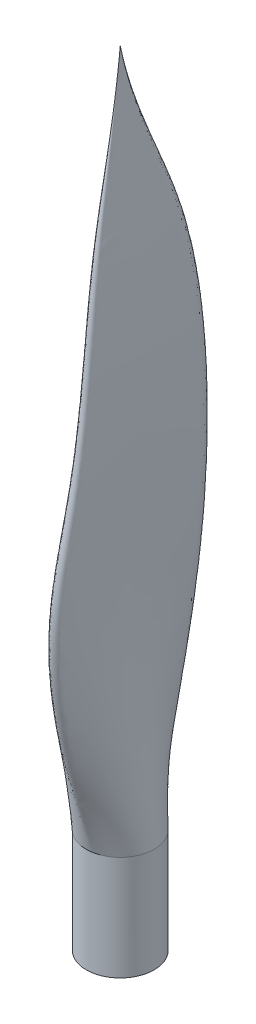
ISO-10303-21;
HEADER;
FILE_DESCRIPTION(('STEP AP214'),'2;1');
FILE_NAME('part.step','',(''),(''),'','','');
FILE_SCHEMA(('AUTOMOTIVE_DESIGN { 1 0 10303 214 1 1 1 1 }'));
ENDSEC;
DATA;
#1=APPLICATION_CONTEXT('core data for automotive mechanical design processes');
#2=APPLICATION_PROTOCOL_DEFINITION('international standard','automotive_design',2000,#1);
#3=PRODUCT_CONTEXT('',#1,'mechanical');
#4=PRODUCT('Part','Part','',(#3));
#5=PRODUCT_RELATED_PRODUCT_CATEGORY('part','',(#4));
#6=PRODUCT_DEFINITION_FORMATION('','',#4);
#7=PRODUCT_DEFINITION_CONTEXT('part definition',#1,'design');
#8=PRODUCT_DEFINITION('design','',#6,#7);
#9=PRODUCT_DEFINITION_SHAPE('','',#8);
#10=(LENGTH_UNIT() NAMED_UNIT(*) SI_UNIT(.MILLI.,.METRE.));
#11=(NAMED_UNIT(*) PLANE_ANGLE_UNIT() SI_UNIT($,.RADIAN.));
#12=(NAMED_UNIT(*) SI_UNIT($,.STERADIAN.) SOLID_ANGLE_UNIT());
#13=UNCERTAINTY_MEASURE_WITH_UNIT(LENGTH_MEASURE(1.E-05),#10,'distance_accuracy_value','');
#14=(GEOMETRIC_REPRESENTATION_CONTEXT(3) GLOBAL_UNCERTAINTY_ASSIGNED_CONTEXT((#13)) GLOBAL_UNIT_ASSIGNED_CONTEXT((#10,
#11,#12)) REPRESENTATION_CONTEXT('',''));
#15=CARTESIAN_POINT('',(0.,0.,0.));
#16=DIRECTION('',(0.,0.,1.));
#17=DIRECTION('',(1.,0.,0.));
#18=AXIS2_PLACEMENT_3D('',#15,#16,#17);
#19=CARTESIAN_POINT('',(0.,25.4,0.));
#20=DIRECTION('',(0.,-1.,0.));
#21=DIRECTION('',(0.,0.,-1.));
#22=AXIS2_PLACEMENT_3D('',#19,#20,#21);
#23=CYLINDRICAL_SURFACE('',#22,8.255);
#24=CARTESIAN_POINT('',(1.84115412709104,25.4,-8.04706011412215));
#25=CARTESIAN_POINT('',(1.49717993514917,25.4,-8.12576084384519));
#26=CARTESIAN_POINT('',(0.986290227768732,25.4,-8.20423412938115));
#27=CARTESIAN_POINT('',(0.327034181211974,25.4,-8.25703622216933));
#28=CARTESIAN_POINT('',(-0.263033159465489,25.4,-8.2568496097391));
#29=CARTESIAN_POINT('',(-0.831131344674344,25.4,-8.22006975737767));
#30=CARTESIAN_POINT('',(-1.39436018145234,25.4,-8.14253171953481));
#31=CARTESIAN_POINT('',(-1.97163806254614,25.4,-8.02471432319632));
#32=CARTESIAN_POINT('',(-2.60310540493009,25.4,-7.84262332708647));
#33=CARTESIAN_POINT('',(-3.08471626282393,25.4,-7.664744642292));
#34=CARTESIAN_POINT('',(-4.16300305604926,25.4,-7.17758326568541));
#35=CARTESIAN_POINT('',(-5.63406914641218,25.4,-6.23048347674027));
#36=CARTESIAN_POINT('',(-7.3724572333223,25.3999999999999,-4.06011158280135));
#37=CARTESIAN_POINT('',(-8.32971236214597,25.4000000000001,-1.30146859576701));
#38=CARTESIAN_POINT('',(-8.26276954584924,25.3999999999999,1.72455790814148));
#39=CARTESIAN_POINT('',(-7.09482791154622,25.4,4.57889572099749));
#40=CARTESIAN_POINT('',(-4.97687527661067,25.4,6.81671506762852));
#41=CARTESIAN_POINT('',(-2.25433759982899,25.4,8.12266447292905));
#42=CARTESIAN_POINT('',(-0.323714364054617,25.4,8.30119679332006));
#43=CARTESIAN_POINT('',(0.68201723579083,25.4,8.22712831785102));
#44=CARTESIAN_POINT('',(0.801778347374316,25.4,8.21676816500025));
#45=CARTESIAN_POINT('',(0.931938469183497,25.4,8.20219557928466));
#46=CARTESIAN_POINT('',(1.0581032988237,25.4,8.18718479491041));
#47=CARTESIAN_POINT('',(1.18248537974389,25.4,8.17053972831056));
#48=CARTESIAN_POINT('',(1.30729725539303,25.4,8.15106429591818));
#49=CARTESIAN_POINT('',(1.43342004251679,25.4,8.12955497261165));
#50=CARTESIAN_POINT('',(1.5617348578608,25.4,8.10680823326937));
#51=CARTESIAN_POINT('',(1.68166405297273,25.4,8.08227742461166));
#52=CARTESIAN_POINT('',(2.63714503524418,25.4,7.8739624725323));
#53=CARTESIAN_POINT('',(4.38080615059333,25.4,7.18954116966648));
#54=CARTESIAN_POINT('',(6.58778687055213,25.4,5.26043698480749));
#55=CARTESIAN_POINT('',(8.01641866313439,25.4,2.62293468221777));
#56=CARTESIAN_POINT('',(8.42366005220756,25.4,-0.351894740143555));
#57=CARTESIAN_POINT('',(7.78040109494694,25.4,-3.21948472135602));
#58=CARTESIAN_POINT('',(6.266955385657,25.4,-5.60105791862049));
#59=CARTESIAN_POINT('',(4.18183763642812,25.4,-7.27157708774657));
#60=CARTESIAN_POINT('',(2.62084253577645,25.4,-7.8686686877953));
#61=CARTESIAN_POINT('',(1.84115412709104,25.4,-8.04706011412215));
#62=B_SPLINE_CURVE_WITH_KNOTS('',3,(#24,#25,#26,#27,#28,#29,#30,#31,#32,#33,#34,#35,#36,#37,#38,
#39,#40,#41,#42,#43,#44,#45,#46,#47,#48,#49,#50,#51,#52,#53,#54,#55,#56,#57,#58,#59,#60,#61),
.UNSPECIFIED.,.T.,.F.,(4,1,1,1,1,1,1,1,2,1,1,1,1,1,1,1,2,1,1,1,1,1,1,1,2,1,1,1,1,1,1,1,4),(0.,
0.0211926335383978,0.0423852670767956,0.0635779006151934,0.0847705341535912,0.105963167691989,
0.127155801230387,0.148348434768785,0.169541068307182,0.221112768587106,0.272684468867029,
0.324256169146952,0.375827869426875,0.427399569706798,0.478971269986721,0.530542970266644,
0.582114670546568,0.586312864422188,0.590511058297807,0.594709252173427,0.598907446049047,
0.603105639924667,0.607303833800287,0.611502027675907,0.615700221551527,0.663737693857586,
0.711775166163645,0.759812638469704,0.807850110775763,0.855887583081823,0.903925055387882,
0.951962527693941,1.),.UNSPECIFIED.);
#63=CARTESIAN_POINT('',(1.84115412709104,25.4,-8.04706011412215));
#64=VERTEX_POINT('',#63);
#65=EDGE_CURVE('E12',#64,#64,#62,.T.);
#66=ORIENTED_EDGE('',*,*,#65,.F.);
#67=EDGE_LOOP('',(#66));
#68=FACE_BOUND('',#67,.T.);
#69=CARTESIAN_POINT('',(0.,0.,0.));
#70=DIRECTION('',(0.,1.,0.));
#71=DIRECTION('',(0.,0.,1.));
#72=AXIS2_PLACEMENT_3D('',#69,#70,#71);
#73=CIRCLE('',#72,8.255);
#74=CARTESIAN_POINT('',(0.,0.,8.255));
#75=VERTEX_POINT('',#74);
#76=EDGE_CURVE('E210',#75,#75,#73,.T.);
#77=ORIENTED_EDGE('',*,*,#76,.T.);
#78=EDGE_LOOP('',(#77));
#79=FACE_BOUND('',#78,.T.);
#80=ADVANCED_FACE('F201',(#68,#79),#23,.T.);
#81=CARTESIAN_POINT('',(0.,0.,0.));
#82=DIRECTION('',(0.,1.,0.));
#83=DIRECTION('',(0.,0.,1.));
#84=AXIS2_PLACEMENT_3D('',#81,#82,#83);
#85=PLANE('',#84);
#86=ORIENTED_EDGE('',*,*,#76,.F.);
#87=EDGE_LOOP('',(#86));
#88=FACE_BOUND('',#87,.T.);
#89=ADVANCED_FACE('F216',(#88),#85,.F.);
#90=CARTESIAN_POINT('',(1.84115412709104,25.4,-8.04706011412215));
#91=CARTESIAN_POINT('',(3.25193581908319,44.423928371545,-9.78031712313258));
#92=CARTESIAN_POINT('',(5.30619347923773,71.9693253666984,-12.120580128144));
#93=CARTESIAN_POINT('',(5.2012290604936,114.112293140247,-14.6789167141253));
#94=CARTESIAN_POINT('',(3.49988283151982,151.891405122874,-13.032066237447));
#95=CARTESIAN_POINT('',(0.922656533270414,175.717015002163,-1.99998733283843));
#96=CARTESIAN_POINT('',(0.,190.5,0.));
#97=CARTESIAN_POINT('',(1.49717993514917,25.4,-8.12576084384519));
#98=CARTESIAN_POINT('',(3.02258788180731,44.4165185098628,-10.0932872446538));
#99=CARTESIAN_POINT('',(5.35057314737717,71.9706156172485,-12.7847195603257));
#100=CARTESIAN_POINT('',(5.18606949551939,114.112075864832,-15.2299437420504));
#101=CARTESIAN_POINT('',(3.50729479196382,151.889799232988,-13.4542906195367));
#102=CARTESIAN_POINT('',(0.917246933791929,175.720230162646,-2.09366665955012));
#103=CARTESIAN_POINT('',(0.,190.5,0.));
#104=CARTESIAN_POINT('',(0.986290227768732,25.4,-8.20423412938115));
#105=CARTESIAN_POINT('',(2.68717177186681,44.3993731419126,-10.6643020251995));
#106=CARTESIAN_POINT('',(5.14691431773129,71.9736292573222,-14.1124173721181));
#107=CARTESIAN_POINT('',(4.99583879884133,114.111519631752,-16.3999608149184));
#108=CARTESIAN_POINT('',(3.35329977934639,151.886445646884,-14.334472390189));
#109=CARTESIAN_POINT('',(0.898292624052649,175.727004195932,-2.28731034055319));
#110=CARTESIAN_POINT('',(0.,190.5,0.));
#111=CARTESIAN_POINT('',(0.327034181211974,25.4,-8.25703622216933));
#112=CARTESIAN_POINT('',(1.87950574964884,44.3794119382437,-11.3816894266538));
#113=CARTESIAN_POINT('',(4.18810321904492,71.9770760939513,-15.8080049400686));
#114=CARTESIAN_POINT('',(3.99725065333323,114.110989226499,-18.13888102842));
#115=CARTESIAN_POINT('',(2.60526046888929,151.881747771933,-15.5427121596919));
#116=CARTESIAN_POINT('',(0.735616362996278,175.736348449487,-2.59508485952896));
#117=CARTESIAN_POINT('',(0.,190.5,0.));
#118=CARTESIAN_POINT('',(-0.263033159465489,25.4,-8.2568496097391));
#119=CARTESIAN_POINT('',(0.931726752205576,44.3653299880243,-11.8753129790084));
#120=CARTESIAN_POINT('',(2.7334052699781,71.9794790756047,-17.0218429743672));
#121=CARTESIAN_POINT('',(2.25171695521837,114.110669406917,-19.4757792169465));
#122=CARTESIAN_POINT('',(1.37351429992004,151.878065442779,-16.3909427946752));
#123=CARTESIAN_POINT('',(0.440292277554416,175.743616774866,-2.84324484653332));
#124=CARTESIAN_POINT('',(0.,190.5,0.));
#125=CARTESIAN_POINT('',(-0.831131344674344,25.4,-8.22006975737767));
#126=CARTESIAN_POINT('',(-0.137649790736217,44.3584705684158,-12.1077391290117));
#127=CARTESIAN_POINT('',(0.984436866039562,71.9806429282082,-17.6600488421525));
#128=CARTESIAN_POINT('',(-0.00946742801504991,114.110526254823,-20.000936758989));
#129=CARTESIAN_POINT('',(-0.13514834657797,151.876186196272,-16.6538979296817));
#130=CARTESIAN_POINT('',(0.0418238496796534,175.747314398141,-2.95531055231167));
#131=CARTESIAN_POINT('',(0.,190.5,0.));
#132=CARTESIAN_POINT('',(-1.39436018145234,25.4,-8.14253171953481));
#133=CARTESIAN_POINT('',(-1.25241955836452,44.3589219462219,-12.0486324584465));
#134=CARTESIAN_POINT('',(-0.892070789512111,71.9805872477329,-17.6712470894075));
#135=CARTESIAN_POINT('',(-2.29066531629809,114.110495998342,-19.5156650422822));
#136=CARTESIAN_POINT('',(-1.60128346522,151.876578540164,-16.2609962270374));
#137=CARTESIAN_POINT('',(-0.371147839447772,175.746577509135,-2.88597525996165));
#138=CARTESIAN_POINT('',(0.,190.5,0.));
#139=CARTESIAN_POINT('',(-1.97163806254614,25.4,-8.02471432319632));
#140=CARTESIAN_POINT('',(-2.32914748715029,44.3676908299642,-11.6857964351248));
#141=CARTESIAN_POINT('',(-2.70813188998264,71.9791109824802,-17.0047155016168));
#142=CARTESIAN_POINT('',(-4.07704998661691,114.110657040954,-18.1863026982294));
#143=CARTESIAN_POINT('',(-2.73368955174035,151.879129616123,-15.3387534844781));
#144=CARTESIAN_POINT('',(-0.69952791224345,175.741577408667,-2.66080355631739));
#145=CARTESIAN_POINT('',(0.,190.5,0.));
#146=CARTESIAN_POINT('',(-2.60310540493009,25.4,-7.84262332708647));
#147=CARTESIAN_POINT('',(-3.31676094489036,44.3843663823477,-11.0222552401379));
#148=CARTESIAN_POINT('',(-4.19958973650646,71.976241254327,-15.667201740982));
#149=CARTESIAN_POINT('',(-5.10231050651033,114.111081631051,-16.4231995906025));
#150=CARTESIAN_POINT('',(-3.37947417739705,151.883179554805,-14.1230946173423));
#151=CARTESIAN_POINT('',(-0.894159305830881,175.733540981258,-2.35344897522832));
#152=CARTESIAN_POINT('',(0.,190.5,0.));
#153=CARTESIAN_POINT('',(-3.08471626282393,25.4,-7.664744642292));
#154=CARTESIAN_POINT('',(-3.78668643466828,44.4000032029981,-10.416495905181));
#155=CARTESIAN_POINT('',(-4.80483199973343,71.9735055061004,-14.4208413853841));
#156=CARTESIAN_POINT('',(-5.29089071055418,114.111564754941,-15.232472610991));
#157=CARTESIAN_POINT('',(-3.48570261404806,151.886401738797,-13.2650058706076));
#158=CARTESIAN_POINT('',(-0.926259412855449,175.727062311381,-2.15273471404465));
#159=CARTESIAN_POINT('',(0.,190.5,0.));
#160=CARTESIAN_POINT('',(-4.16300305604926,25.4,-7.17758326568541));
#161=CARTESIAN_POINT('',(-4.75095093626708,44.4242338249097,-9.22051641074802));
#162=CARTESIAN_POINT('',(-5.32901970524825,71.9693008623247,-12.1486437897185));
#163=CARTESIAN_POINT('',(-5.32559390650783,114.112247660175,-13.3139975105815));
#164=CARTESIAN_POINT('',(-3.39953184415019,151.891839957212,-11.8599668637737));
#165=CARTESIAN_POINT('',(-0.96016686119634,175.716205279192,-1.81797000076624));
#166=CARTESIAN_POINT('',(0.,190.5,0.));
#167=CARTESIAN_POINT('',(-5.63406914641218,25.4,-6.23048347674027));
#168=CARTESIAN_POINT('',(-5.73627500635091,44.4495649735887,-7.35745679527305));
#169=CARTESIAN_POINT('',(-5.93925980452607,71.9650376166274,-8.8822461276516));
#170=CARTESIAN_POINT('',(-5.23457578248082,114.112710364502,-10.6575548996887));
#171=CARTESIAN_POINT('',(-3.26858167326649,151.899226373204,-9.90264653387319));
#172=CARTESIAN_POINT('',(-0.935102466623599,175.701730017172,-1.3772760743114));
#173=CARTESIAN_POINT('',(0.,190.5,0.));
#174=CARTESIAN_POINT('',(-7.3724572333223,25.3999999999999,-4.06011158280135));
#175=CARTESIAN_POINT('',(-6.93389630752563,44.4597741430992,-4.09357467256563));
#176=CARTESIAN_POINT('',(-6.26213655741706,71.963805428967,-3.93187598195676));
#177=CARTESIAN_POINT('',(-4.79128432828589,114.111974442191,-6.83157466638817));
#178=CARTESIAN_POINT('',(-2.93967011796197,151.908449666949,-7.08007032068755));
#179=CARTESIAN_POINT('',(-0.858242455663168,175.684421472703,-0.731792295467551));
#180=CARTESIAN_POINT('',(0.,190.5,0.));
#181=CARTESIAN_POINT('',(-8.32971236214597,25.4000000000001,-1.30146859576701));
#182=CARTESIAN_POINT('',(-7.39355881376975,44.4573009782813,-0.486869382902787));
#183=CARTESIAN_POINT('',(-6.06194019260981,71.9648462102592,1.00584139435668));
#184=CARTESIAN_POINT('',(-4.0530447132994,114.11074395821,-3.14878413882903));
#185=CARTESIAN_POINT('',(-2.51432862618208,151.915755198957,-4.31947855885464));
#186=CARTESIAN_POINT('',(-0.708435036659855,175.671089652029,-0.126244846547242));
#187=CARTESIAN_POINT('',(0.,190.5,0.));
#188=CARTESIAN_POINT('',(-8.26276954584924,25.3999999999999,1.72455790814148));
#189=CARTESIAN_POINT('',(-7.0562484539579,44.450524680401,3.25435898795937));
#190=CARTESIAN_POINT('',(-5.35282349523606,71.9665344657388,5.88728321176872));
#191=CARTESIAN_POINT('',(-3.03436286823088,114.10958052511,0.39804664773972));
#192=CARTESIAN_POINT('',(-1.98241797476248,151.920819627909,-1.6025380337972));
#193=CARTESIAN_POINT('',(-0.503537251429323,175.662028721944,0.446798367788752));
#194=CARTESIAN_POINT('',(0.,190.5,0.));
#195=CARTESIAN_POINT('',(-7.09482791154622,25.4,4.57889572099749));
#196=CARTESIAN_POINT('',(-5.85416898537577,44.4408237683852,6.85273221916928));
#197=CARTESIAN_POINT('',(-4.15131448267477,71.9685946707329,10.6825777153337));
#198=CARTESIAN_POINT('',(-1.7478815590794,114.108591917082,3.81085260427875));
#199=CARTESIAN_POINT('',(-1.34276880496047,151.923485611444,1.09625416505431));
#200=CARTESIAN_POINT('',(-0.245242671588871,175.657478397108,0.984070324237363));
#201=CARTESIAN_POINT('',(0.,190.5,0.));
#202=CARTESIAN_POINT('',(-4.97687527661067,25.4,6.81671506762852));
#203=CARTESIAN_POINT('',(-3.90978250052306,44.4187097085383,10.0355146126489));
#204=CARTESIAN_POINT('',(-2.45480281490692,71.9728193779999,15.3653558978912));
#205=CARTESIAN_POINT('',(-0.201918025390703,114.107233538607,7.08747526475879));
#206=CARTESIAN_POINT('',(-0.582219597779455,151.923500560333,3.79259161970385));
#207=CARTESIAN_POINT('',(0.0608291690581933,175.658242191734,1.49364873083071));
#208=CARTESIAN_POINT('',(0.,190.5,0.));
#209=CARTESIAN_POINT('',(-2.25433759982899,25.4,8.12266447292905));
#210=CARTESIAN_POINT('',(-1.33375369485937,44.3677040262478,12.5774760107898));
#211=CARTESIAN_POINT('',(-0.263538466577323,71.9824196111269,19.9017373638599));
#212=CARTESIAN_POINT('',(1.59708625733762,114.104373715482,10.2257056833467));
#213=CARTESIAN_POINT('',(0.304588172988622,151.921684624163,6.52223831321908));
#214=CARTESIAN_POINT('',(0.422970768970979,175.663403096267,1.94504205187558));
#215=CARTESIAN_POINT('',(0.,190.5,0.));
#216=CARTESIAN_POINT('',(-0.323714364054617,25.4,8.30119679332006));
#217=CARTESIAN_POINT('',(0.408725368204494,44.2992890395725,13.8317190720243));
#218=CARTESIAN_POINT('',(1.57797079091785,71.9951483050161,22.7796465508092));
#219=CARTESIAN_POINT('',(2.94904856039841,114.100819227925,12.2350870642795));
#220=CARTESIAN_POINT('',(1.01487869387209,151.917342923535,8.33690921726529));
#221=CARTESIAN_POINT('',(0.676497205286913,175.673826763893,2.27948970713105));
#222=CARTESIAN_POINT('',(0.,190.5,0.));
#223=CARTESIAN_POINT('',(0.68201723579083,25.4,8.22712831785102));
#224=CARTESIAN_POINT('',(1.54298362170854,44.2528860997852,14.3464047620057));
#225=CARTESIAN_POINT('',(2.63267800106836,72.0039174278858,24.2948987812544));
#226=CARTESIAN_POINT('',(3.73836183048474,114.098150645209,13.2914669561318));
#227=CARTESIAN_POINT('',(1.41716310330764,151.916143413887,9.36203137848957));
#228=CARTESIAN_POINT('',(0.842550405378267,175.677690599496,2.39362066282499));
#229=CARTESIAN_POINT('',(0.,190.5,0.));
#230=CARTESIAN_POINT('',(0.801778347374316,25.4,8.21676816500025));
#231=CARTESIAN_POINT('',(1.68491694453947,44.2457846084258,14.42477117534));
#232=CARTESIAN_POINT('',(2.84198236921877,72.0052607784866,24.5116804237701));
#233=CARTESIAN_POINT('',(3.87917322314153,114.097739728078,13.4252557105047));
#234=CARTESIAN_POINT('',(1.5052189076266,151.915976893203,9.52456517044034));
#235=CARTESIAN_POINT('',(0.867905462307406,175.678250595236,2.40998601338715));
#236=CARTESIAN_POINT('',(0.,190.5,0.));
#237=CARTESIAN_POINT('',(0.931938469183497,25.4,8.20219557928466));
#238=CARTESIAN_POINT('',(1.93151016244523,44.2373672013131,14.5014583057855));
#239=CARTESIAN_POINT('',(3.26799885597561,72.0069036977398,24.7485684797359));
#240=CARTESIAN_POINT('',(4.12770339265276,114.09715655165,13.5395146804045));
#241=CARTESIAN_POINT('',(1.75503787425847,151.916430394649,9.77156292386616));
#242=CARTESIAN_POINT('',(0.900237810263141,175.677718690434,2.40228695212746));
#243=CARTESIAN_POINT('',(0.,190.5,0.));
#244=CARTESIAN_POINT('',(1.0581032988237,25.4,8.18718479491041));
#245=CARTESIAN_POINT('',(2.20212371990758,44.2324508362961,14.5209553735285));
#246=CARTESIAN_POINT('',(3.79041335458438,72.0078799353278,24.8333862564953));
#247=CARTESIAN_POINT('',(4.37883125858369,114.096784324571,13.5666077098908));
#248=CARTESIAN_POINT('',(2.14521433655231,151.916909332466,9.9444588059548));
#249=CARTESIAN_POINT('',(0.910291698591051,175.677014789222,2.38228239835888));
#250=CARTESIAN_POINT('',(0.,190.5,0.));
#251=CARTESIAN_POINT('',(1.18248537974389,25.4,8.17053972831056));
#252=CARTESIAN_POINT('',(2.47576414137225,44.2317533297143,14.4763924992297));
#253=CARTESIAN_POINT('',(4.32660957535947,72.0080125813576,24.7455179581592));
#254=CARTESIAN_POINT('',(4.61549802566433,114.096742631159,13.5243072063321));
#255=CARTESIAN_POINT('',(2.62593012443705,151.916902005318,9.94738137292336));
#256=CARTESIAN_POINT('',(0.901144525113982,175.677053206493,2.36872985826588));
#257=CARTESIAN_POINT('',(0.,190.5,0.));
#258=CARTESIAN_POINT('',(1.30729725539303,25.4,8.15106429591818));
#259=CARTESIAN_POINT('',(2.7227810637493,44.2359430469938,14.3626237846415));
#260=CARTESIAN_POINT('',(4.78925013500737,72.0071392552685,24.4689530659384));
#261=CARTESIAN_POINT('',(4.83221191845983,114.097138372897,13.4211261827931));
#262=CARTESIAN_POINT('',(3.0654422147348,151.915962061227,9.74787805264842));
#263=CARTESIAN_POINT('',(0.892399294176822,175.678629979322,2.36989605945696));
#264=CARTESIAN_POINT('',(0.,190.5,0.));
#265=CARTESIAN_POINT('',(1.43342004251679,25.4,8.12955497261165));
#266=CARTESIAN_POINT('',(2.92588176681235,44.2439089752287,14.2042019373066));
#267=CARTESIAN_POINT('',(5.1287801729436,72.0055149960865,24.0732904445053));
#268=CARTESIAN_POINT('',(5.02019784873948,114.097822096208,13.2554740732814));
#269=CARTESIAN_POINT('',(3.35411914784084,151.914640180212,9.42759477258543));
#270=CARTESIAN_POINT('',(0.899217860208275,175.680773257532,2.37204140300435));
#271=CARTESIAN_POINT('',(0.,190.5,0.));
#272=CARTESIAN_POINT('',(1.5617348578608,25.4,8.10680823326937));
#273=CARTESIAN_POINT('',(3.07628637492338,44.2545638519954,14.0230476773619));
#274=CARTESIAN_POINT('',(5.30201263685587,72.003405742262,23.6308847949349));
#275=CARTESIAN_POINT('',(5.15603183391763,114.098616509433,13.0213227027683));
#276=CARTESIAN_POINT('',(3.48506438675208,151.91368541999,9.09713509751425));
#277=CARTESIAN_POINT('',(0.917121956622545,175.682145919968,2.35703702728463));
#278=CARTESIAN_POINT('',(0.,190.5,0.));
#279=CARTESIAN_POINT('',(1.68166405297273,25.4,8.08227742461166));
#280=CARTESIAN_POINT('',(3.1475925511459,44.2624769944777,13.9002790554087));
#281=CARTESIAN_POINT('',(5.32632073157193,72.0018938098251,23.3396378901271));
#282=CARTESIAN_POINT('',(5.19445273810908,114.099102947281,12.8336143348677));
#283=CARTESIAN_POINT('',(3.5024381607512,151.913677598573,8.9096604445809));
#284=CARTESIAN_POINT('',(0.921695847880551,175.681877150439,2.33051469635673));
#285=CARTESIAN_POINT('',(0.,190.5,0.));
#286=CARTESIAN_POINT('',(2.63714503524418,25.4,7.8739624725323));
#287=CARTESIAN_POINT('',(3.78621265767225,44.3104832647447,13.0913418625027));
#288=CARTESIAN_POINT('',(5.20233609429305,71.9927318428258,21.6543549727434));
#289=CARTESIAN_POINT('',(5.23744139930534,114.102034260202,11.6225271309381));
#290=CARTESIAN_POINT('',(3.47653917598813,151.913763794071,7.8591924751684));
#291=CARTESIAN_POINT('',(0.946422205522145,175.680001112291,2.16299177141531));
#292=CARTESIAN_POINT('',(0.,190.5,0.));
#293=CARTESIAN_POINT('',(4.38080615059333,25.4,7.18954116966648));
#294=CARTESIAN_POINT('',(4.64472249396847,44.3730399528699,11.5239466245468));
#295=CARTESIAN_POINT('',(5.0384665617096,71.9810173609427,18.5849593169939));
#296=CARTESIAN_POINT('',(5.28990743131585,114.105428110133,9.4074290408859));
#297=CARTESIAN_POINT('',(3.4777791114959,151.916760412261,5.9913546567724));
#298=CARTESIAN_POINT('',(0.913426379927831,175.672257984121,1.80179641682175));
#299=CARTESIAN_POINT('',(0.,190.5,0.));
#300=CARTESIAN_POINT('',(6.58778687055213,25.4,5.26043698480749));
#301=CARTESIAN_POINT('',(5.94238462841359,44.4097039419602,8.59506898723919));
#302=CARTESIAN_POINT('',(4.78809014509837,71.974114691735,14.1220305784726));
#303=CARTESIAN_POINT('',(5.37430320889039,114.107487255136,6.08883326545749));
#304=CARTESIAN_POINT('',(3.4451720867961,151.918042436538,3.24921284536401));
#305=CARTESIAN_POINT('',(0.926894488584444,175.668591034746,1.30132554405796));
#306=CARTESIAN_POINT('',(0.,190.5,0.));
#307=CARTESIAN_POINT('',(8.01641866313439,25.4,2.62293468221777));
#308=CARTESIAN_POINT('',(6.73444181394648,44.4190117391664,5.29304126464446));
#309=CARTESIAN_POINT('',(4.63576656889073,71.9723912208337,9.75684296961429));
#310=CARTESIAN_POINT('',(5.42486848631863,114.107955170343,2.75530888459083));
#311=CARTESIAN_POINT('',(3.43168648312887,151.918739232766,0.56332660860507));
#312=CARTESIAN_POINT('',(0.923327299211562,175.666977976115,0.784900846690767));
#313=CARTESIAN_POINT('',(0.,190.5,0.));
#314=CARTESIAN_POINT('',(8.42366005220756,25.4,-0.351894740143555));
#315=CARTESIAN_POINT('',(6.96866217354593,44.4251901341896,1.80100318728092));
#316=CARTESIAN_POINT('',(4.59063409323285,71.9711191036701,5.44821547469933));
#317=CARTESIAN_POINT('',(5.43998947003711,114.108508882832,-0.60621229290071));
#318=CARTESIAN_POINT('',(3.42655925462057,151.917555417085,-2.09897508703535));
#319=CARTESIAN_POINT('',(0.92436549200329,175.668931586499,0.263570672436063));
#320=CARTESIAN_POINT('',(0.,190.5,0.));
#321=CARTESIAN_POINT('',(7.78040109494694,25.4,-3.21948472135602));
#322=CARTESIAN_POINT('',(6.60072405705777,44.4395105257555,-1.62638415907198));
#323=CARTESIAN_POINT('',(4.66150285186325,71.9681380160546,1.1420040100786));
#324=CARTESIAN_POINT('',(5.41629297083162,114.109854067362,-4.00573463098798));
#325=CARTESIAN_POINT('',(3.43422669572812,151.914393185095,-4.76140886977416));
#326=CARTESIAN_POINT('',(0.923445422020977,175.674228235069,-0.270625016552304));
#327=CARTESIAN_POINT('',(0.,190.5,0.));
#328=CARTESIAN_POINT('',(6.266955385657,25.4,-5.60105791862049));
#329=CARTESIAN_POINT('',(5.7592397937824,44.4568854222379,-4.77824421199937));
#330=CARTESIAN_POINT('',(4.82342035971325,71.9644050378797,-3.20572109053648));
#331=CARTESIAN_POINT('',(5.36240443840726,114.111706389881,-7.46022157024789));
#332=CARTESIAN_POINT('',(3.44969021705372,151.909065212048,-7.45094026417791));
#333=CARTESIAN_POINT('',(0.925147697024292,175.683394072517,-0.820051624129062));
#334=CARTESIAN_POINT('',(0.,190.5,0.));
#335=CARTESIAN_POINT('',(4.18183763642812,25.4,-7.27157708774657));
#336=CARTESIAN_POINT('',(4.53683350778545,44.4623672470771,-7.5350993901119));
#337=CARTESIAN_POINT('',(5.05905702214829,71.9627769594943,-7.62094852760585));
#338=CARTESIAN_POINT('',(5.28331978028647,114.11314544066,-10.9931617102145));
#339=CARTESIAN_POINT('',(3.47758429268709,151.901596769416,-10.1883046693736));
#340=CARTESIAN_POINT('',(0.917644603426962,175.696917509251,-1.39524902049047));
#341=CARTESIAN_POINT('',(0.,190.5,0.));
#342=CARTESIAN_POINT('',(2.62084253577645,25.4,-7.8686686877953));
#343=CARTESIAN_POINT('',(3.77180019390855,44.4407243504262,-9.07090583085686));
#344=CARTESIAN_POINT('',(5.20559781351561,71.9664007478702,-10.615171207493));
#345=CARTESIAN_POINT('',(5.23559133931569,114.112785639761,-13.4299003733347));
#346=CARTESIAN_POINT('',(3.48308209536228,151.895045203319,-12.0750076432508));
#347=CARTESIAN_POINT('',(0.934918505557328,175.709727178193,-1.7876438289313));
#348=CARTESIAN_POINT('',(0.,190.5,0.));
#349=CARTESIAN_POINT('',(1.84115412709104,25.4,-8.04706011412215));
#350=CARTESIAN_POINT('',(3.25193581908319,44.423928371545,-9.78031712313258));
#351=CARTESIAN_POINT('',(5.30619347923773,71.9693253666984,-12.120580128144));
#352=CARTESIAN_POINT('',(5.2012290604936,114.112293140247,-14.6789167141253));
#353=CARTESIAN_POINT('',(3.49988283151982,151.891405122874,-13.032066237447));
#354=CARTESIAN_POINT('',(0.922656533270414,175.717015002163,-1.99998733283843));
#355=CARTESIAN_POINT('',(0.,190.5,0.));
#356=B_SPLINE_SURFACE_WITH_KNOTS('',3,3,((#90,#91,#92,#93,#94,#95,#96),(#97,#98,#99,#100,#101,
#102,#103),(#104,#105,#106,#107,#108,#109,#110),(#111,#112,#113,#114,#115,#116,#117),(#118,#119,
#120,#121,#122,#123,#124),(#125,#126,#127,#128,#129,#130,#131),(#132,#133,#134,#135,#136,#137,
#138),(#139,#140,#141,#142,#143,#144,#145),(#146,#147,#148,#149,#150,#151,#152),(#153,#154,#155,
#156,#157,#158,#159),(#160,#161,#162,#163,#164,#165,#166),(#167,#168,#169,#170,#171,#172,#173),
(#174,#175,#176,#177,#178,#179,#180),(#181,#182,#183,#184,#185,#186,#187),(#188,#189,#190,#191,
#192,#193,#194),(#195,#196,#197,#198,#199,#200,#201),(#202,#203,#204,#205,#206,#207,#208),(#209,
#210,#211,#212,#213,#214,#215),(#216,#217,#218,#219,#220,#221,#222),(#223,#224,#225,#226,#227,
#228,#229),(#230,#231,#232,#233,#234,#235,#236),(#237,#238,#239,#240,#241,#242,#243),(#244,#245,
#246,#247,#248,#249,#250),(#251,#252,#253,#254,#255,#256,#257),(#258,#259,#260,#261,#262,#263,
#264),(#265,#266,#267,#268,#269,#270,#271),(#272,#273,#274,#275,#276,#277,#278),(#279,#280,#281,
#282,#283,#284,#285),(#286,#287,#288,#289,#290,#291,#292),(#293,#294,#295,#296,#297,#298,#299),
(#300,#301,#302,#303,#304,#305,#306),(#307,#308,#309,#310,#311,#312,#313),(#314,#315,#316,#317,
#318,#319,#320),(#321,#322,#323,#324,#325,#326,#327),(#328,#329,#330,#331,#332,#333,#334),(#335,
#336,#337,#338,#339,#340,#341),(#342,#343,#344,#345,#346,#347,#348),(#349,#350,#351,#352,#353,
#354,#355)),.UNSPECIFIED.,.T.,.F.,.F.,(4,1,1,1,1,1,1,1,2,1,1,1,1,1,1,1,2,1,1,1,1,1,1,1,2,1,1,1,
1,1,1,1,4),(4,1,1,1,4),(0.,0.0211926335383978,0.0423852670767956,0.0635779006151934,
0.0847705341535912,0.105963167691989,0.127155801230387,0.148348434768785,0.169541068307182,
0.221112768587106,0.272684468867029,0.324256169146952,0.375827869426875,0.427399569706798,
0.478971269986721,0.530542970266644,0.582114670546568,0.586312864422188,0.590511058297807,
0.594709252173427,0.598907446049047,0.603105639924667,0.607303833800287,0.611502027675907,
0.615700221551527,0.663737693857586,0.711775166163645,0.759812638469704,0.807850110775763,
0.855887583081823,0.903925055387882,0.951962527693941,1.),(0.,0.345583246384174,
0.498546071417462,0.766331586254813,1.),.UNSPECIFIED.);
#357=CARTESIAN_POINT('',(0.,190.5,0.));
#358=VERTEX_POINT('',#357);
#359=VERTEX_LOOP('',#358);
#360=FACE_BOUND('',#359,.T.);
#361=ORIENTED_EDGE('',*,*,#65,.T.);
#362=EDGE_LOOP('',(#361));
#363=FACE_BOUND('',#362,.T.);
#364=ADVANCED_FACE('F213',(#360,#363),#356,.T.);
#365=CLOSED_SHELL('',(#80,#89,#364));
#366=MANIFOLD_SOLID_BREP('B2',#365);
#367=ADVANCED_BREP_SHAPE_REPRESENTATION('',(#18,#366),#14);
#368=SHAPE_DEFINITION_REPRESENTATION(#9,#367);
ENDSEC;
END-ISO-10303-21;
